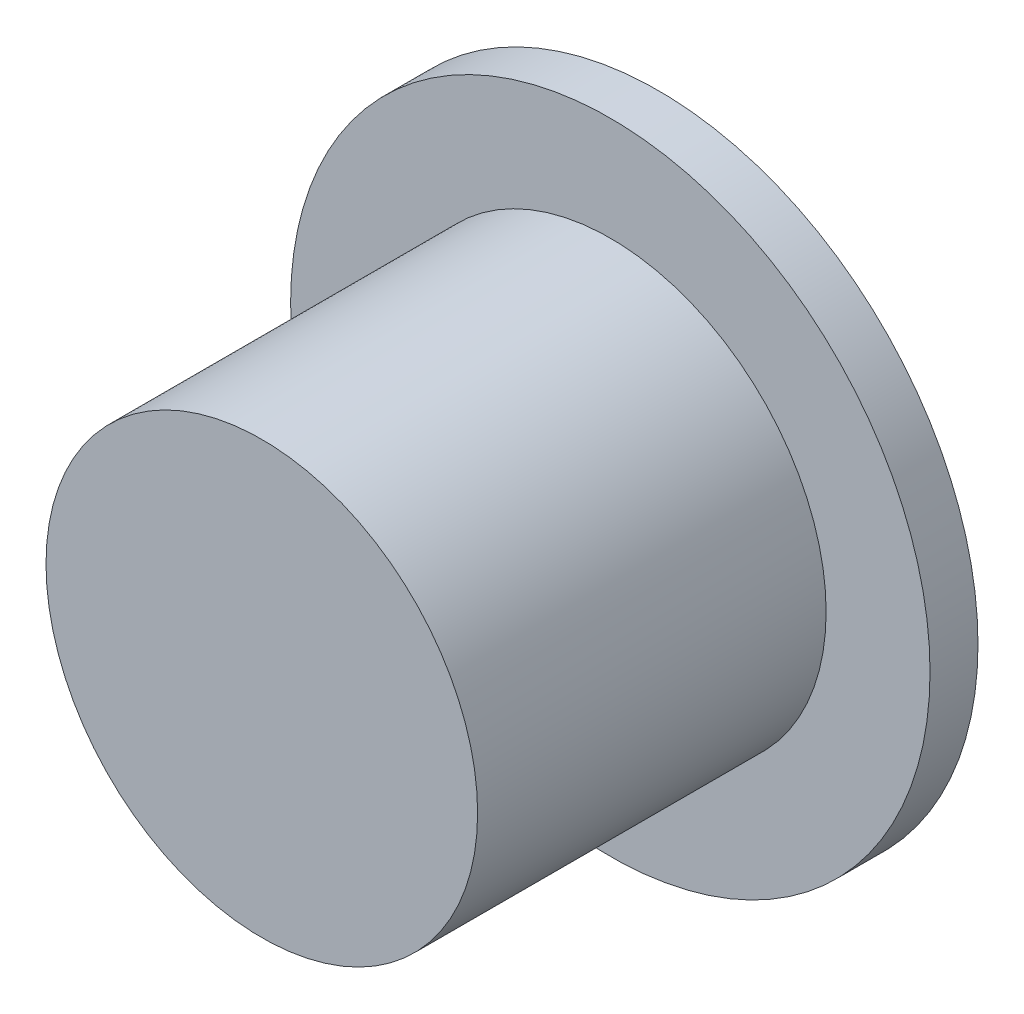
ISO-10303-21;
HEADER;
FILE_DESCRIPTION(('STEP AP214'),'2;1');
FILE_NAME('part.step','',(''),(''),'','','');
FILE_SCHEMA(('AUTOMOTIVE_DESIGN { 1 0 10303 214 1 1 1 1 }'));
ENDSEC;
DATA;
#1=APPLICATION_CONTEXT('core data for automotive mechanical design processes');
#2=APPLICATION_PROTOCOL_DEFINITION('international standard','automotive_design',2000,#1);
#3=PRODUCT_CONTEXT('',#1,'mechanical');
#4=PRODUCT('Part','Part','',(#3));
#5=PRODUCT_RELATED_PRODUCT_CATEGORY('part','',(#4));
#6=PRODUCT_DEFINITION_FORMATION('','',#4);
#7=PRODUCT_DEFINITION_CONTEXT('part definition',#1,'design');
#8=PRODUCT_DEFINITION('design','',#6,#7);
#9=PRODUCT_DEFINITION_SHAPE('','',#8);
#10=(LENGTH_UNIT() NAMED_UNIT(*) SI_UNIT(.MILLI.,.METRE.));
#11=(NAMED_UNIT(*) PLANE_ANGLE_UNIT() SI_UNIT($,.RADIAN.));
#12=(NAMED_UNIT(*) SI_UNIT($,.STERADIAN.) SOLID_ANGLE_UNIT());
#13=UNCERTAINTY_MEASURE_WITH_UNIT(LENGTH_MEASURE(1.E-05),#10,'distance_accuracy_value','');
#14=(GEOMETRIC_REPRESENTATION_CONTEXT(3) GLOBAL_UNCERTAINTY_ASSIGNED_CONTEXT((#13)) GLOBAL_UNIT_ASSIGNED_CONTEXT((#10,
#11,#12)) REPRESENTATION_CONTEXT('',''));
#15=CARTESIAN_POINT('',(0.,0.,0.));
#16=DIRECTION('',(0.,0.,1.));
#17=DIRECTION('',(1.,0.,0.));
#18=AXIS2_PLACEMENT_3D('',#15,#16,#17);
#19=CARTESIAN_POINT('',(-55.9808100713669,-89.6590909091174,1.5));
#20=DIRECTION('',(0.,0.,-1.));
#21=DIRECTION('',(-1.,0.,0.));
#22=AXIS2_PLACEMENT_3D('',#19,#20,#21);
#23=CYLINDRICAL_SURFACE('',#22,9.99999999999999);
#24=CARTESIAN_POINT('',(-55.9808100713669,-89.6590909091174,1.5));
#25=DIRECTION('',(0.,0.,1.));
#26=DIRECTION('',(1.,0.,0.));
#27=AXIS2_PLACEMENT_3D('',#24,#25,#26);
#28=CIRCLE('',#27,9.99999999999999);
#29=CARTESIAN_POINT('',(-45.9808100713669,-89.6590909091174,1.5));
#30=VERTEX_POINT('',#29);
#31=EDGE_CURVE('E38',#30,#30,#28,.T.);
#32=ORIENTED_EDGE('',*,*,#31,.F.);
#33=EDGE_LOOP('',(#32));
#34=FACE_BOUND('',#33,.T.);
#35=CARTESIAN_POINT('',(-55.9808100713669,-89.6590909091174,0.));
#36=DIRECTION('',(0.,0.,1.));
#37=DIRECTION('',(1.,0.,0.));
#38=AXIS2_PLACEMENT_3D('',#35,#36,#37);
#39=CIRCLE('',#38,9.99999999999999);
#40=CARTESIAN_POINT('',(-45.9808100713669,-89.6590909091174,0.));
#41=VERTEX_POINT('',#40);
#42=EDGE_CURVE('E34',#41,#41,#39,.T.);
#43=ORIENTED_EDGE('',*,*,#42,.T.);
#44=EDGE_LOOP('',(#43));
#45=FACE_BOUND('',#44,.T.);
#46=ADVANCED_FACE('F31',(#34,#45),#23,.T.);
#47=CARTESIAN_POINT('',(-55.9808100713669,-89.6590909091174,1.5));
#48=DIRECTION('',(0.,0.,1.));
#49=DIRECTION('',(1.,0.,0.));
#50=AXIS2_PLACEMENT_3D('',#47,#48,#49);
#51=PLANE('',#50);
#52=CARTESIAN_POINT('',(-55.9808100713669,-89.6590909091174,1.5));
#53=DIRECTION('',(0.,0.,1.));
#54=DIRECTION('',(1.,0.,0.));
#55=AXIS2_PLACEMENT_3D('',#52,#53,#54);
#56=CIRCLE('',#55,6.75);
#57=CARTESIAN_POINT('',(-49.2308100713669,-89.6590909091174,1.5));
#58=VERTEX_POINT('',#57);
#59=EDGE_CURVE('E10',#58,#58,#56,.T.);
#60=ORIENTED_EDGE('',*,*,#59,.F.);
#61=EDGE_LOOP('',(#60));
#62=FACE_BOUND('',#61,.T.);
#63=ORIENTED_EDGE('',*,*,#31,.T.);
#64=EDGE_LOOP('',(#63));
#65=FACE_BOUND('',#64,.T.);
#66=ADVANCED_FACE('F67',(#62,#65),#51,.T.);
#67=CARTESIAN_POINT('',(-55.9808100713669,-89.6590909091174,0.));
#68=DIRECTION('',(0.,0.,1.));
#69=DIRECTION('',(1.,0.,0.));
#70=AXIS2_PLACEMENT_3D('',#67,#68,#69);
#71=PLANE('',#70);
#72=CARTESIAN_POINT('',(-55.9808100713669,-89.6590909091174,0.));
#73=DIRECTION('',(0.,0.,-1.));
#74=DIRECTION('',(-1.,0.,0.));
#75=AXIS2_PLACEMENT_3D('',#72,#73,#74);
#76=CIRCLE('',#75,4.00000000000001);
#77=CARTESIAN_POINT('',(-59.9808100713669,-89.6590909091174,0.));
#78=VERTEX_POINT('',#77);
#79=EDGE_CURVE('E48',#78,#78,#76,.T.);
#80=ORIENTED_EDGE('',*,*,#79,.F.);
#81=EDGE_LOOP('',(#80));
#82=FACE_BOUND('',#81,.T.);
#83=ORIENTED_EDGE('',*,*,#42,.F.);
#84=EDGE_LOOP('',(#83));
#85=FACE_BOUND('',#84,.T.);
#86=ADVANCED_FACE('F63',(#82,#85),#71,.F.);
#87=CARTESIAN_POINT('',(-55.9808100713669,-89.6590909091174,12.4));
#88=DIRECTION('',(0.,0.,-1.));
#89=DIRECTION('',(-1.,0.,0.));
#90=AXIS2_PLACEMENT_3D('',#87,#88,#89);
#91=CYLINDRICAL_SURFACE('',#90,6.75);
#92=CARTESIAN_POINT('',(-55.9808100713669,-89.6590909091174,12.4));
#93=DIRECTION('',(0.,0.,1.));
#94=DIRECTION('',(1.,0.,0.));
#95=AXIS2_PLACEMENT_3D('',#92,#93,#94);
#96=CIRCLE('',#95,6.75);
#97=CARTESIAN_POINT('',(-49.2308100713669,-89.6590909091174,12.4));
#98=VERTEX_POINT('',#97);
#99=EDGE_CURVE('E44',#98,#98,#96,.T.);
#100=ORIENTED_EDGE('',*,*,#99,.F.);
#101=EDGE_LOOP('',(#100));
#102=FACE_BOUND('',#101,.T.);
#103=ORIENTED_EDGE('',*,*,#59,.T.);
#104=EDGE_LOOP('',(#103));
#105=FACE_BOUND('',#104,.T.);
#106=ADVANCED_FACE('F66',(#102,#105),#91,.T.);
#107=CARTESIAN_POINT('',(-55.9808100713669,-89.6590909091174,12.4));
#108=DIRECTION('',(0.,0.,1.));
#109=DIRECTION('',(1.,0.,0.));
#110=AXIS2_PLACEMENT_3D('',#107,#108,#109);
#111=PLANE('',#110);
#112=ORIENTED_EDGE('',*,*,#99,.T.);
#113=EDGE_LOOP('',(#112));
#114=FACE_BOUND('',#113,.T.);
#115=ADVANCED_FACE('F59',(#114),#111,.T.);
#116=CARTESIAN_POINT('',(-55.9808100713669,-89.6590909091174,10.));
#117=DIRECTION('',(0.,0.,-1.));
#118=DIRECTION('',(-1.,0.,0.));
#119=AXIS2_PLACEMENT_3D('',#116,#117,#118);
#120=CYLINDRICAL_SURFACE('',#119,4.00000000000001);
#121=CARTESIAN_POINT('',(-55.9808100713669,-89.6590909091174,10.));
#122=DIRECTION('',(0.,0.,-1.));
#123=DIRECTION('',(-1.,0.,0.));
#124=AXIS2_PLACEMENT_3D('',#121,#122,#123);
#125=CIRCLE('',#124,4.00000000000001);
#126=CARTESIAN_POINT('',(-59.9808100713669,-89.6590909091174,10.));
#127=VERTEX_POINT('',#126);
#128=EDGE_CURVE('E47',#127,#127,#125,.T.);
#129=ORIENTED_EDGE('',*,*,#128,.F.);
#130=EDGE_LOOP('',(#129));
#131=FACE_BOUND('',#130,.T.);
#132=ORIENTED_EDGE('',*,*,#79,.T.);
#133=EDGE_LOOP('',(#132));
#134=FACE_BOUND('',#133,.T.);
#135=ADVANCED_FACE('F56',(#131,#134),#120,.F.);
#136=CARTESIAN_POINT('',(-55.9808100713669,-89.6590909091174,10.));
#137=DIRECTION('',(0.,0.,-1.));
#138=DIRECTION('',(-1.,0.,0.));
#139=AXIS2_PLACEMENT_3D('',#136,#137,#138);
#140=PLANE('',#139);
#141=ORIENTED_EDGE('',*,*,#128,.T.);
#142=EDGE_LOOP('',(#141));
#143=FACE_BOUND('',#142,.T.);
#144=ADVANCED_FACE('F54',(#143),#140,.T.);
#145=CLOSED_SHELL('',(#46,#66,#86,#106,#115,#135,#144));
#146=MANIFOLD_SOLID_BREP('B2',#145);
#147=ADVANCED_BREP_SHAPE_REPRESENTATION('',(#18,#146),#14);
#148=SHAPE_DEFINITION_REPRESENTATION(#9,#147);
ENDSEC;
END-ISO-10303-21;
